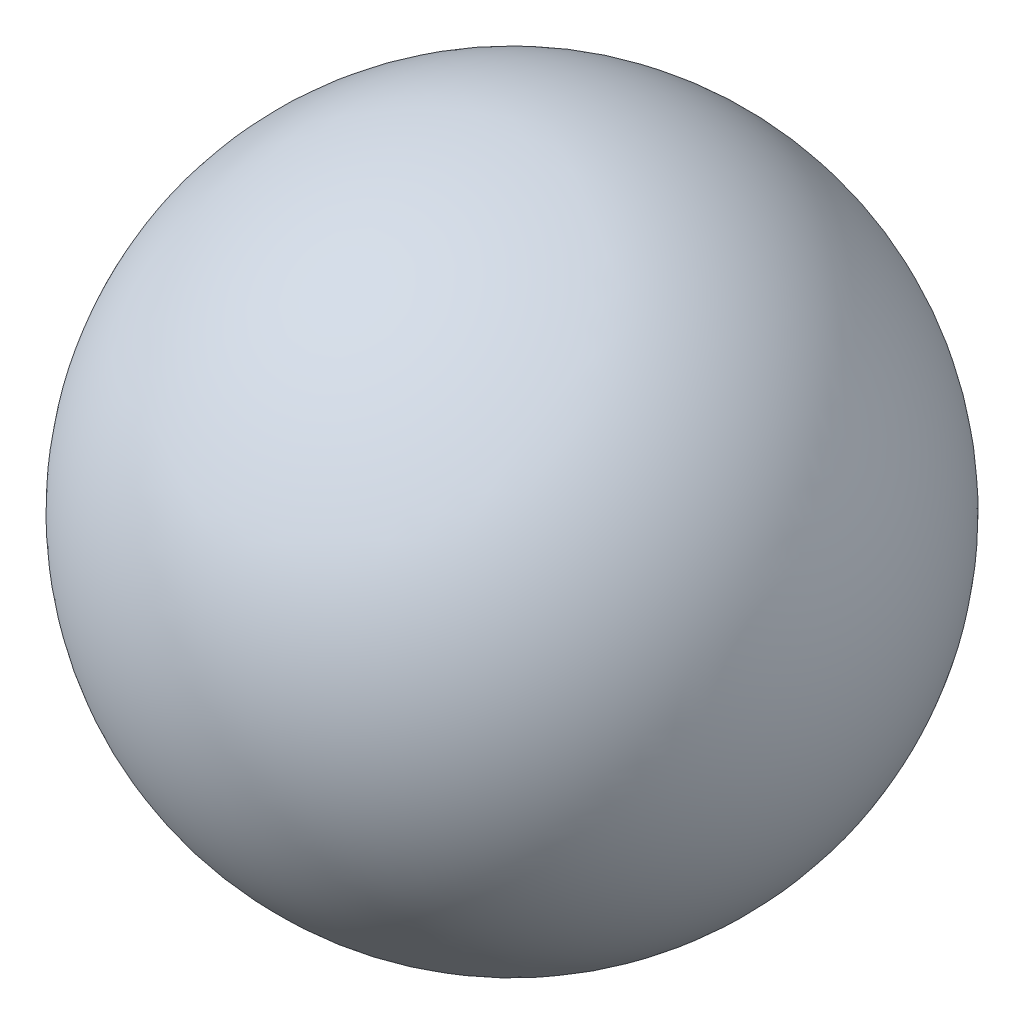
ISO-10303-21;
HEADER;
FILE_DESCRIPTION(('STEP AP214'),'2;1');
FILE_NAME('part.step','',(''),(''),'','','');
FILE_SCHEMA(('AUTOMOTIVE_DESIGN { 1 0 10303 214 1 1 1 1 }'));
ENDSEC;
DATA;
#1=APPLICATION_CONTEXT('core data for automotive mechanical design processes');
#2=APPLICATION_PROTOCOL_DEFINITION('international standard','automotive_design',2000,#1);
#3=PRODUCT_CONTEXT('',#1,'mechanical');
#4=PRODUCT('Part','Part','',(#3));
#5=PRODUCT_RELATED_PRODUCT_CATEGORY('part','',(#4));
#6=PRODUCT_DEFINITION_FORMATION('','',#4);
#7=PRODUCT_DEFINITION_CONTEXT('part definition',#1,'design');
#8=PRODUCT_DEFINITION('design','',#6,#7);
#9=PRODUCT_DEFINITION_SHAPE('','',#8);
#10=(LENGTH_UNIT() NAMED_UNIT(*) SI_UNIT(.MILLI.,.METRE.));
#11=(NAMED_UNIT(*) PLANE_ANGLE_UNIT() SI_UNIT($,.RADIAN.));
#12=(NAMED_UNIT(*) SI_UNIT($,.STERADIAN.) SOLID_ANGLE_UNIT());
#13=UNCERTAINTY_MEASURE_WITH_UNIT(LENGTH_MEASURE(1.E-05),#10,'distance_accuracy_value','');
#14=(GEOMETRIC_REPRESENTATION_CONTEXT(3) GLOBAL_UNCERTAINTY_ASSIGNED_CONTEXT((#13)) GLOBAL_UNIT_ASSIGNED_CONTEXT((#10,
#11,#12)) REPRESENTATION_CONTEXT('',''));
#15=CARTESIAN_POINT('',(0.,0.,0.));
#16=DIRECTION('',(0.,0.,1.));
#17=DIRECTION('',(1.,0.,0.));
#18=AXIS2_PLACEMENT_3D('',#15,#16,#17);
#19=CARTESIAN_POINT('',(0.,0.,0.));
#20=DIRECTION('',(-1.,0.,0.));
#21=DIRECTION('',(0.,0.,-1.));
#22=AXIS2_PLACEMENT_3D('',#19,#20,#21);
#23=SPHERICAL_SURFACE('',#22,34.925);
#24=CARTESIAN_POINT('',(-34.925,0.,0.));
#25=VERTEX_POINT('',#24);
#26=VERTEX_LOOP('',#25);
#27=FACE_BOUND('',#26,.T.);
#28=ADVANCED_FACE('F28',(#27),#23,.T.);
#29=CLOSED_SHELL('',(#28));
#30=MANIFOLD_SOLID_BREP('B2',#29);
#31=ADVANCED_BREP_SHAPE_REPRESENTATION('',(#18,#30),#14);
#32=SHAPE_DEFINITION_REPRESENTATION(#9,#31);
ENDSEC;
END-ISO-10303-21;
